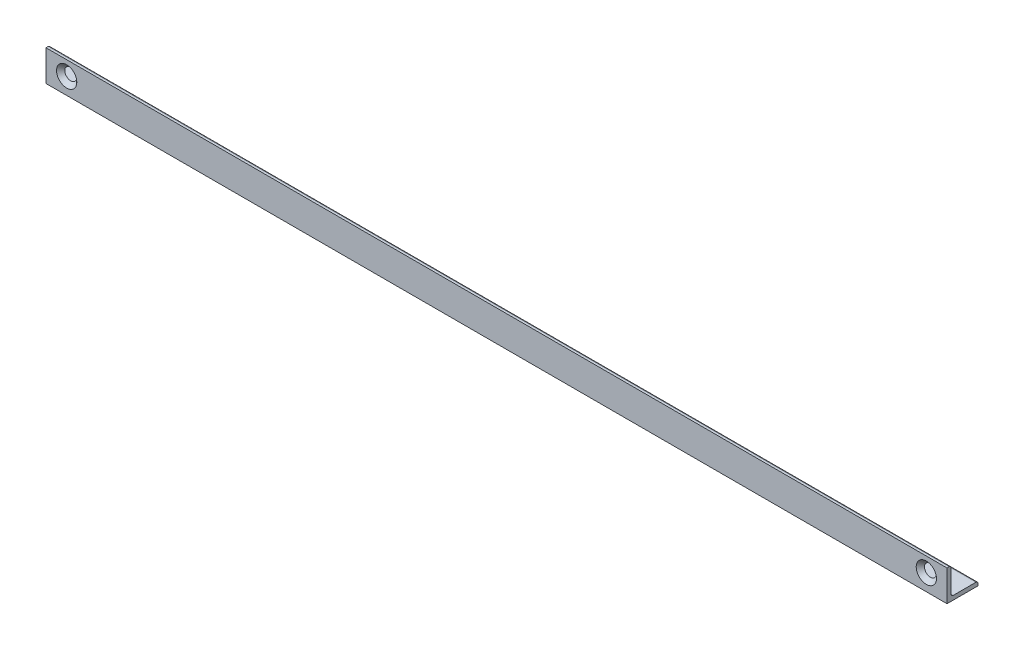
ISO-10303-21;
HEADER;
FILE_DESCRIPTION(('STEP AP214'),'2;1');
FILE_NAME('part.step','',(''),(''),'','','');
FILE_SCHEMA(('AUTOMOTIVE_DESIGN { 1 0 10303 214 1 1 1 1 }'));
ENDSEC;
DATA;
#1=APPLICATION_CONTEXT('core data for automotive mechanical design processes');
#2=APPLICATION_PROTOCOL_DEFINITION('international standard','automotive_design',2000,#1);
#3=PRODUCT_CONTEXT('',#1,'mechanical');
#4=PRODUCT('Part','Part','',(#3));
#5=PRODUCT_RELATED_PRODUCT_CATEGORY('part','',(#4));
#6=PRODUCT_DEFINITION_FORMATION('','',#4);
#7=PRODUCT_DEFINITION_CONTEXT('part definition',#1,'design');
#8=PRODUCT_DEFINITION('design','',#6,#7);
#9=PRODUCT_DEFINITION_SHAPE('','',#8);
#10=(LENGTH_UNIT() NAMED_UNIT(*) SI_UNIT(.MILLI.,.METRE.));
#11=(NAMED_UNIT(*) PLANE_ANGLE_UNIT() SI_UNIT($,.RADIAN.));
#12=(NAMED_UNIT(*) SI_UNIT($,.STERADIAN.) SOLID_ANGLE_UNIT());
#13=UNCERTAINTY_MEASURE_WITH_UNIT(LENGTH_MEASURE(1.E-05),#10,'distance_accuracy_value','');
#14=(GEOMETRIC_REPRESENTATION_CONTEXT(3) GLOBAL_UNCERTAINTY_ASSIGNED_CONTEXT((#13)) GLOBAL_UNIT_ASSIGNED_CONTEXT((#10,
#11,#12)) REPRESENTATION_CONTEXT('',''));
#15=CARTESIAN_POINT('',(0.,0.,0.));
#16=DIRECTION('',(0.,0.,1.));
#17=DIRECTION('',(1.,0.,0.));
#18=AXIS2_PLACEMENT_3D('',#15,#16,#17);
#19=CARTESIAN_POINT('',(436.,0.,0.));
#20=DIRECTION('',(0.,1.,0.));
#21=DIRECTION('',(0.,0.,1.));
#22=AXIS2_PLACEMENT_3D('',#19,#20,#21);
#23=PLANE('',#22);
#24=CARTESIAN_POINT('',(90.,0.,-9.));
#25=DIRECTION('',(0.,-1.,0.));
#26=DIRECTION('',(0.,0.,-1.));
#27=AXIS2_PLACEMENT_3D('',#24,#25,#26);
#28=CIRCLE('',#27,2.75000000000001);
#29=CARTESIAN_POINT('',(90.,0.,-11.75));
#30=VERTEX_POINT('',#29);
#31=EDGE_CURVE('E362',#30,#30,#28,.T.);
#32=ORIENTED_EDGE('',*,*,#31,.F.);
#33=EDGE_LOOP('',(#32));
#34=FACE_BOUND('',#33,.T.);
#35=CARTESIAN_POINT('',(372.,0.,-9.));
#36=DIRECTION('',(0.,-1.,0.));
#37=DIRECTION('',(0.,0.,-1.));
#38=AXIS2_PLACEMENT_3D('',#35,#36,#37);
#39=CIRCLE('',#38,2.74999999999998);
#40=CARTESIAN_POINT('',(372.,0.,-11.75));
#41=VERTEX_POINT('',#40);
#42=EDGE_CURVE('E358',#41,#41,#39,.T.);
#43=ORIENTED_EDGE('',*,*,#42,.F.);
#44=EDGE_LOOP('',(#43));
#45=FACE_BOUND('',#44,.T.);
#46=DIRECTION('',(0.,0.,-1.));
#47=VECTOR('',#46,1.);
#48=CARTESIAN_POINT('',(0.,0.,0.));
#49=LINE('',#48,#47);
#50=CARTESIAN_POINT('',(0.,0.,0.));
#51=VERTEX_POINT('',#50);
#52=CARTESIAN_POINT('',(0.,0.,-15.));
#53=VERTEX_POINT('',#52);
#54=EDGE_CURVE('E139',#51,#53,#49,.T.);
#55=ORIENTED_EDGE('',*,*,#54,.T.);
#56=DIRECTION('',(-1.,0.,0.));
#57=VECTOR('',#56,1.);
#58=CARTESIAN_POINT('',(436.,0.,-15.));
#59=LINE('',#58,#57);
#60=CARTESIAN_POINT('',(436.,0.,-15.));
#61=VERTEX_POINT('',#60);
#62=EDGE_CURVE('E172',#61,#53,#59,.T.);
#63=ORIENTED_EDGE('',*,*,#62,.F.);
#64=DIRECTION('',(0.,0.,-1.));
#65=VECTOR('',#64,1.);
#66=CARTESIAN_POINT('',(436.,0.,0.));
#67=LINE('',#66,#65);
#68=CARTESIAN_POINT('',(436.,0.,0.));
#69=VERTEX_POINT('',#68);
#70=EDGE_CURVE('E156',#69,#61,#67,.T.);
#71=ORIENTED_EDGE('',*,*,#70,.F.);
#72=DIRECTION('',(-1.,0.,0.));
#73=VECTOR('',#72,1.);
#74=CARTESIAN_POINT('',(436.,0.,0.));
#75=LINE('',#74,#73);
#76=EDGE_CURVE('E135',#69,#51,#75,.T.);
#77=ORIENTED_EDGE('',*,*,#76,.T.);
#78=EDGE_LOOP('',(#55,#63,#71,#77));
#79=FACE_BOUND('',#78,.T.);
#80=ADVANCED_FACE('F35',(#34,#45,#79),#23,.F.);
#81=CARTESIAN_POINT('',(436.,1.,-15.));
#82=DIRECTION('',(0.,0.,1.));
#83=DIRECTION('',(1.,0.,0.));
#84=AXIS2_PLACEMENT_3D('',#81,#82,#83);
#85=PLANE('',#84);
#86=DIRECTION('',(0.,1.,0.));
#87=VECTOR('',#86,1.);
#88=CARTESIAN_POINT('',(0.,1.,-15.));
#89=LINE('',#88,#87);
#90=CARTESIAN_POINT('',(0.,1.,-15.));
#91=VERTEX_POINT('',#90);
#92=EDGE_CURVE('E142',#53,#91,#89,.T.);
#93=ORIENTED_EDGE('',*,*,#92,.T.);
#94=DIRECTION('',(-1.,0.,0.));
#95=VECTOR('',#94,1.);
#96=CARTESIAN_POINT('',(436.,1.,-15.));
#97=LINE('',#96,#95);
#98=CARTESIAN_POINT('',(436.,1.,-15.));
#99=VERTEX_POINT('',#98);
#100=EDGE_CURVE('E169',#99,#91,#97,.T.);
#101=ORIENTED_EDGE('',*,*,#100,.F.);
#102=DIRECTION('',(0.,1.,0.));
#103=VECTOR('',#102,1.);
#104=CARTESIAN_POINT('',(436.,1.,-15.));
#105=LINE('',#104,#103);
#106=EDGE_CURVE('E99',#61,#99,#105,.T.);
#107=ORIENTED_EDGE('',*,*,#106,.F.);
#108=ORIENTED_EDGE('',*,*,#62,.T.);
#109=EDGE_LOOP('',(#93,#101,#107,#108));
#110=FACE_BOUND('',#109,.T.);
#111=ADVANCED_FACE('F216',(#110),#85,.F.);
#112=CARTESIAN_POINT('',(436.,1.,-14.));
#113=DIRECTION('',(-1.,0.,0.));
#114=DIRECTION('',(0.,0.,1.));
#115=AXIS2_PLACEMENT_3D('',#112,#113,#114);
#116=CYLINDRICAL_SURFACE('',#115,1.);
#117=CARTESIAN_POINT('',(0.,1.,-14.));
#118=DIRECTION('',(1.,0.,0.));
#119=DIRECTION('',(0.,0.,1.));
#120=AXIS2_PLACEMENT_3D('',#117,#118,#119);
#121=CIRCLE('',#120,1.);
#122=CARTESIAN_POINT('',(0.,2.,-14.));
#123=VERTEX_POINT('',#122);
#124=EDGE_CURVE('E145',#91,#123,#121,.T.);
#125=ORIENTED_EDGE('',*,*,#124,.T.);
#126=DIRECTION('',(-1.,0.,0.));
#127=VECTOR('',#126,1.);
#128=CARTESIAN_POINT('',(436.,2.,-14.));
#129=LINE('',#128,#127);
#130=CARTESIAN_POINT('',(436.,2.,-14.));
#131=VERTEX_POINT('',#130);
#132=EDGE_CURVE('E166',#131,#123,#129,.T.);
#133=ORIENTED_EDGE('',*,*,#132,.F.);
#134=CARTESIAN_POINT('',(436.,1.,-14.));
#135=DIRECTION('',(1.,0.,0.));
#136=DIRECTION('',(0.,0.,1.));
#137=AXIS2_PLACEMENT_3D('',#134,#135,#136);
#138=CIRCLE('',#137,1.);
#139=EDGE_CURVE('E352',#99,#131,#138,.T.);
#140=ORIENTED_EDGE('',*,*,#139,.F.);
#141=ORIENTED_EDGE('',*,*,#100,.T.);
#142=EDGE_LOOP('',(#125,#133,#140,#141));
#143=FACE_BOUND('',#142,.T.);
#144=ADVANCED_FACE('F222',(#143),#116,.T.);
#145=CARTESIAN_POINT('',(436.,2.,-3.));
#146=DIRECTION('',(0.,-1.,0.));
#147=DIRECTION('',(0.,0.,-1.));
#148=AXIS2_PLACEMENT_3D('',#145,#146,#147);
#149=PLANE('',#148);
#150=CARTESIAN_POINT('',(90.,2.,-9.));
#151=DIRECTION('',(0.,-1.,0.));
#152=DIRECTION('',(0.,0.,-1.));
#153=AXIS2_PLACEMENT_3D('',#150,#151,#152);
#154=CIRCLE('',#153,2.75000000000001);
#155=CARTESIAN_POINT('',(90.,2.,-11.75));
#156=VERTEX_POINT('',#155);
#157=EDGE_CURVE('E340',#156,#156,#154,.T.);
#158=ORIENTED_EDGE('',*,*,#157,.T.);
#159=EDGE_LOOP('',(#158));
#160=FACE_BOUND('',#159,.T.);
#161=CARTESIAN_POINT('',(372.,2.,-9.));
#162=DIRECTION('',(0.,-1.,0.));
#163=DIRECTION('',(0.,0.,-1.));
#164=AXIS2_PLACEMENT_3D('',#161,#162,#163);
#165=CIRCLE('',#164,2.74999999999998);
#166=CARTESIAN_POINT('',(372.,2.,-11.75));
#167=VERTEX_POINT('',#166);
#168=EDGE_CURVE('E143',#167,#167,#165,.T.);
#169=ORIENTED_EDGE('',*,*,#168,.T.);
#170=EDGE_LOOP('',(#169));
#171=FACE_BOUND('',#170,.T.);
#172=DIRECTION('',(0.,0.,1.));
#173=VECTOR('',#172,1.);
#174=CARTESIAN_POINT('',(0.,2.,-3.));
#175=LINE('',#174,#173);
#176=CARTESIAN_POINT('',(0.,2.,-3.));
#177=VERTEX_POINT('',#176);
#178=EDGE_CURVE('E147',#123,#177,#175,.T.);
#179=ORIENTED_EDGE('',*,*,#178,.T.);
#180=DIRECTION('',(-1.,0.,0.));
#181=VECTOR('',#180,1.);
#182=CARTESIAN_POINT('',(436.,2.,-3.));
#183=LINE('',#182,#181);
#184=CARTESIAN_POINT('',(436.,2.,-3.));
#185=VERTEX_POINT('',#184);
#186=EDGE_CURVE('E163',#185,#177,#183,.T.);
#187=ORIENTED_EDGE('',*,*,#186,.F.);
#188=DIRECTION('',(0.,0.,1.));
#189=VECTOR('',#188,1.);
#190=CARTESIAN_POINT('',(436.,2.,-3.));
#191=LINE('',#190,#189);
#192=EDGE_CURVE('E350',#131,#185,#191,.T.);
#193=ORIENTED_EDGE('',*,*,#192,.F.);
#194=ORIENTED_EDGE('',*,*,#132,.T.);
#195=EDGE_LOOP('',(#179,#187,#193,#194));
#196=FACE_BOUND('',#195,.T.);
#197=ADVANCED_FACE('F261',(#160,#171,#196),#149,.F.);
#198=CARTESIAN_POINT('',(436.,3.,-3.));
#199=DIRECTION('',(-1.,0.,0.));
#200=DIRECTION('',(0.,0.,1.));
#201=AXIS2_PLACEMENT_3D('',#198,#199,#200);
#202=CYLINDRICAL_SURFACE('',#201,1.);
#203=CARTESIAN_POINT('',(0.,3.,-3.));
#204=DIRECTION('',(-1.,0.,0.));
#205=DIRECTION('',(0.,0.,-1.));
#206=AXIS2_PLACEMENT_3D('',#203,#204,#205);
#207=CIRCLE('',#206,1.);
#208=CARTESIAN_POINT('',(0.,3.,-2.));
#209=VERTEX_POINT('',#208);
#210=EDGE_CURVE('E149',#177,#209,#207,.T.);
#211=ORIENTED_EDGE('',*,*,#210,.T.);
#212=DIRECTION('',(-1.,0.,0.));
#213=VECTOR('',#212,1.);
#214=CARTESIAN_POINT('',(436.,3.,-2.));
#215=LINE('',#214,#213);
#216=CARTESIAN_POINT('',(436.,3.,-2.));
#217=VERTEX_POINT('',#216);
#218=EDGE_CURVE('E160',#217,#209,#215,.T.);
#219=ORIENTED_EDGE('',*,*,#218,.F.);
#220=CARTESIAN_POINT('',(436.,3.,-3.));
#221=DIRECTION('',(-1.,0.,0.));
#222=DIRECTION('',(0.,0.,-1.));
#223=AXIS2_PLACEMENT_3D('',#220,#221,#222);
#224=CIRCLE('',#223,1.);
#225=EDGE_CURVE('E349',#185,#217,#224,.T.);
#226=ORIENTED_EDGE('',*,*,#225,.F.);
#227=ORIENTED_EDGE('',*,*,#186,.T.);
#228=EDGE_LOOP('',(#211,#219,#226,#227));
#229=FACE_BOUND('',#228,.T.);
#230=ADVANCED_FACE('F192',(#229),#202,.F.);
#231=CARTESIAN_POINT('',(436.,14.,-2.));
#232=DIRECTION('',(0.,0.,1.));
#233=DIRECTION('',(0.,-1.,0.));
#234=AXIS2_PLACEMENT_3D('',#231,#232,#233);
#235=PLANE('',#234);
#236=CARTESIAN_POINT('',(10.,8.,-2.));
#237=DIRECTION('',(0.,0.,1.));
#238=DIRECTION('',(0.,-1.,0.));
#239=AXIS2_PLACEMENT_3D('',#236,#237,#238);
#240=CIRCLE('',#239,2.89800000000004);
#241=CARTESIAN_POINT('',(10.,5.10199999999996,-2.));
#242=VERTEX_POINT('',#241);
#243=EDGE_CURVE('E177',#242,#242,#240,.T.);
#244=ORIENTED_EDGE('',*,*,#243,.T.);
#245=EDGE_LOOP('',(#244));
#246=FACE_BOUND('',#245,.T.);
#247=CARTESIAN_POINT('',(426.,8.,-2.));
#248=DIRECTION('',(0.,0.,1.));
#249=DIRECTION('',(0.,-1.,0.));
#250=AXIS2_PLACEMENT_3D('',#247,#248,#249);
#251=CIRCLE('',#250,2.89800000000004);
#252=CARTESIAN_POINT('',(426.,5.10199999999996,-2.));
#253=VERTEX_POINT('',#252);
#254=EDGE_CURVE('E174',#253,#253,#251,.T.);
#255=ORIENTED_EDGE('',*,*,#254,.T.);
#256=EDGE_LOOP('',(#255));
#257=FACE_BOUND('',#256,.T.);
#258=DIRECTION('',(0.,1.,0.));
#259=VECTOR('',#258,1.);
#260=CARTESIAN_POINT('',(0.,14.,-2.));
#261=LINE('',#260,#259);
#262=CARTESIAN_POINT('',(0.,14.,-2.));
#263=VERTEX_POINT('',#262);
#264=EDGE_CURVE('E151',#209,#263,#261,.T.);
#265=ORIENTED_EDGE('',*,*,#264,.T.);
#266=DIRECTION('',(-1.,0.,0.));
#267=VECTOR('',#266,1.);
#268=CARTESIAN_POINT('',(436.,14.,-2.));
#269=LINE('',#268,#267);
#270=CARTESIAN_POINT('',(436.,14.,-2.));
#271=VERTEX_POINT('',#270);
#272=EDGE_CURVE('E130',#271,#263,#269,.T.);
#273=ORIENTED_EDGE('',*,*,#272,.F.);
#274=DIRECTION('',(0.,1.,0.));
#275=VECTOR('',#274,1.);
#276=CARTESIAN_POINT('',(436.,14.,-2.));
#277=LINE('',#276,#275);
#278=EDGE_CURVE('E121',#217,#271,#277,.T.);
#279=ORIENTED_EDGE('',*,*,#278,.F.);
#280=ORIENTED_EDGE('',*,*,#218,.T.);
#281=EDGE_LOOP('',(#265,#273,#279,#280));
#282=FACE_BOUND('',#281,.T.);
#283=ADVANCED_FACE('F189',(#246,#257,#282),#235,.F.);
#284=CARTESIAN_POINT('',(436.,14.,-1.));
#285=DIRECTION('',(-1.,0.,0.));
#286=DIRECTION('',(0.,0.,1.));
#287=AXIS2_PLACEMENT_3D('',#284,#285,#286);
#288=CYLINDRICAL_SURFACE('',#287,1.);
#289=CARTESIAN_POINT('',(0.,14.,-1.));
#290=DIRECTION('',(1.,0.,0.));
#291=DIRECTION('',(0.,0.,1.));
#292=AXIS2_PLACEMENT_3D('',#289,#290,#291);
#293=CIRCLE('',#292,1.);
#294=CARTESIAN_POINT('',(0.,15.,-1.));
#295=VERTEX_POINT('',#294);
#296=EDGE_CURVE('E129',#263,#295,#293,.T.);
#297=ORIENTED_EDGE('',*,*,#296,.T.);
#298=DIRECTION('',(-1.,0.,0.));
#299=VECTOR('',#298,1.);
#300=CARTESIAN_POINT('',(436.,15.,-1.));
#301=LINE('',#300,#299);
#302=CARTESIAN_POINT('',(436.,15.,-1.));
#303=VERTEX_POINT('',#302);
#304=EDGE_CURVE('E126',#303,#295,#301,.T.);
#305=ORIENTED_EDGE('',*,*,#304,.F.);
#306=CARTESIAN_POINT('',(436.,14.,-1.));
#307=DIRECTION('',(1.,0.,0.));
#308=DIRECTION('',(0.,0.,1.));
#309=AXIS2_PLACEMENT_3D('',#306,#307,#308);
#310=CIRCLE('',#309,1.);
#311=EDGE_CURVE('E115',#271,#303,#310,.T.);
#312=ORIENTED_EDGE('',*,*,#311,.F.);
#313=ORIENTED_EDGE('',*,*,#272,.T.);
#314=EDGE_LOOP('',(#297,#305,#312,#313));
#315=FACE_BOUND('',#314,.T.);
#316=ADVANCED_FACE('F127',(#315),#288,.T.);
#317=CARTESIAN_POINT('',(436.,15.,0.));
#318=DIRECTION('',(0.,-1.,0.));
#319=DIRECTION('',(0.,0.,-1.));
#320=AXIS2_PLACEMENT_3D('',#317,#318,#319);
#321=PLANE('',#320);
#322=DIRECTION('',(0.,0.,1.));
#323=VECTOR('',#322,1.);
#324=CARTESIAN_POINT('',(0.,15.,0.));
#325=LINE('',#324,#323);
#326=CARTESIAN_POINT('',(0.,15.,0.));
#327=VERTEX_POINT('',#326);
#328=EDGE_CURVE('E84',#295,#327,#325,.T.);
#329=ORIENTED_EDGE('',*,*,#328,.T.);
#330=DIRECTION('',(-1.,0.,0.));
#331=VECTOR('',#330,1.);
#332=CARTESIAN_POINT('',(436.,15.,0.));
#333=LINE('',#332,#331);
#334=CARTESIAN_POINT('',(436.,15.,0.));
#335=VERTEX_POINT('',#334);
#336=EDGE_CURVE('E131',#335,#327,#333,.T.);
#337=ORIENTED_EDGE('',*,*,#336,.F.);
#338=DIRECTION('',(0.,0.,1.));
#339=VECTOR('',#338,1.);
#340=CARTESIAN_POINT('',(436.,15.,0.));
#341=LINE('',#340,#339);
#342=EDGE_CURVE('E119',#303,#335,#341,.T.);
#343=ORIENTED_EDGE('',*,*,#342,.F.);
#344=ORIENTED_EDGE('',*,*,#304,.T.);
#345=EDGE_LOOP('',(#329,#337,#343,#344));
#346=FACE_BOUND('',#345,.T.);
#347=ADVANCED_FACE('F133',(#346),#321,.F.);
#348=CARTESIAN_POINT('',(436.,0.,0.));
#349=DIRECTION('',(0.,0.,-1.));
#350=DIRECTION('',(-1.,0.,0.));
#351=AXIS2_PLACEMENT_3D('',#348,#349,#350);
#352=PLANE('',#351);
#353=CARTESIAN_POINT('',(10.,8.,0.));
#354=DIRECTION('',(0.,0.,-1.));
#355=DIRECTION('',(-1.,0.,0.));
#356=AXIS2_PLACEMENT_3D('',#353,#354,#355);
#357=CIRCLE('',#356,4.89800000000001);
#358=CARTESIAN_POINT('',(5.10199999999999,8.,0.));
#359=VERTEX_POINT('',#358);
#360=EDGE_CURVE('E11',#359,#359,#357,.T.);
#361=ORIENTED_EDGE('',*,*,#360,.T.);
#362=EDGE_LOOP('',(#361));
#363=FACE_BOUND('',#362,.T.);
#364=CARTESIAN_POINT('',(426.,8.,0.));
#365=DIRECTION('',(0.,0.,-1.));
#366=DIRECTION('',(-1.,0.,0.));
#367=AXIS2_PLACEMENT_3D('',#364,#365,#366);
#368=CIRCLE('',#367,4.89800000000001);
#369=CARTESIAN_POINT('',(421.102,8.,0.));
#370=VERTEX_POINT('',#369);
#371=EDGE_CURVE('E44',#370,#370,#368,.T.);
#372=ORIENTED_EDGE('',*,*,#371,.T.);
#373=EDGE_LOOP('',(#372));
#374=FACE_BOUND('',#373,.T.);
#375=DIRECTION('',(0.,-1.,0.));
#376=VECTOR('',#375,1.);
#377=CARTESIAN_POINT('',(0.,0.,0.));
#378=LINE('',#377,#376);
#379=EDGE_CURVE('E90',#327,#51,#378,.T.);
#380=ORIENTED_EDGE('',*,*,#379,.T.);
#381=ORIENTED_EDGE('',*,*,#76,.F.);
#382=DIRECTION('',(0.,-1.,0.));
#383=VECTOR('',#382,1.);
#384=CARTESIAN_POINT('',(436.,0.,0.));
#385=LINE('',#384,#383);
#386=EDGE_CURVE('E52',#335,#69,#385,.T.);
#387=ORIENTED_EDGE('',*,*,#386,.F.);
#388=ORIENTED_EDGE('',*,*,#336,.T.);
#389=EDGE_LOOP('',(#380,#381,#387,#388));
#390=FACE_BOUND('',#389,.T.);
#391=ADVANCED_FACE('F182',(#363,#374,#390),#352,.F.);
#392=CARTESIAN_POINT('',(436.,1.,-14.));
#393=DIRECTION('',(-1.,0.,0.));
#394=DIRECTION('',(0.,0.,1.));
#395=AXIS2_PLACEMENT_3D('',#392,#393,#394);
#396=PLANE('',#395);
#397=ORIENTED_EDGE('',*,*,#70,.T.);
#398=ORIENTED_EDGE('',*,*,#106,.T.);
#399=ORIENTED_EDGE('',*,*,#139,.T.);
#400=ORIENTED_EDGE('',*,*,#192,.T.);
#401=ORIENTED_EDGE('',*,*,#225,.T.);
#402=ORIENTED_EDGE('',*,*,#278,.T.);
#403=ORIENTED_EDGE('',*,*,#311,.T.);
#404=ORIENTED_EDGE('',*,*,#342,.T.);
#405=ORIENTED_EDGE('',*,*,#386,.T.);
#406=EDGE_LOOP('',(#397,#398,#399,#400,#401,#402,#403,#404,#405));
#407=FACE_BOUND('',#406,.T.);
#408=ADVANCED_FACE('F117',(#407),#396,.F.);
#409=CARTESIAN_POINT('',(0.,1.,-14.));
#410=DIRECTION('',(-1.,0.,0.));
#411=DIRECTION('',(0.,0.,1.));
#412=AXIS2_PLACEMENT_3D('',#409,#410,#411);
#413=PLANE('',#412);
#414=ORIENTED_EDGE('',*,*,#54,.F.);
#415=ORIENTED_EDGE('',*,*,#379,.F.);
#416=ORIENTED_EDGE('',*,*,#328,.F.);
#417=ORIENTED_EDGE('',*,*,#296,.F.);
#418=ORIENTED_EDGE('',*,*,#264,.F.);
#419=ORIENTED_EDGE('',*,*,#210,.F.);
#420=ORIENTED_EDGE('',*,*,#178,.F.);
#421=ORIENTED_EDGE('',*,*,#124,.F.);
#422=ORIENTED_EDGE('',*,*,#92,.F.);
#423=EDGE_LOOP('',(#414,#415,#416,#417,#418,#419,#420,#421,#422));
#424=FACE_BOUND('',#423,.T.);
#425=ADVANCED_FACE('F200',(#424),#413,.T.);
#426=CARTESIAN_POINT('',(372.,2.,-9.));
#427=DIRECTION('',(0.,-1.,0.));
#428=DIRECTION('',(0.,0.,-1.));
#429=AXIS2_PLACEMENT_3D('',#426,#427,#428);
#430=CYLINDRICAL_SURFACE('',#429,2.74999999999998);
#431=ORIENTED_EDGE('',*,*,#168,.F.);
#432=EDGE_LOOP('',(#431));
#433=FACE_BOUND('',#432,.T.);
#434=ORIENTED_EDGE('',*,*,#42,.T.);
#435=EDGE_LOOP('',(#434));
#436=FACE_BOUND('',#435,.T.);
#437=ADVANCED_FACE('F233',(#433,#436),#430,.F.);
#438=CARTESIAN_POINT('',(90.,2.,-9.));
#439=DIRECTION('',(0.,-1.,0.));
#440=DIRECTION('',(0.,0.,-1.));
#441=AXIS2_PLACEMENT_3D('',#438,#439,#440);
#442=CYLINDRICAL_SURFACE('',#441,2.75000000000001);
#443=ORIENTED_EDGE('',*,*,#157,.F.);
#444=EDGE_LOOP('',(#443));
#445=FACE_BOUND('',#444,.T.);
#446=ORIENTED_EDGE('',*,*,#31,.T.);
#447=EDGE_LOOP('',(#446));
#448=FACE_BOUND('',#447,.T.);
#449=ADVANCED_FACE('F228',(#445,#448),#442,.F.);
#450=CARTESIAN_POINT('',(10.,8.,-2.09800000000004));
#451=DIRECTION('',(0.,0.,1.));
#452=DIRECTION('',(1.,0.,0.));
#453=AXIS2_PLACEMENT_3D('',#450,#451,#452);
#454=CONICAL_SURFACE('',#453,2.8,0.785398163397443);
#455=ORIENTED_EDGE('',*,*,#360,.F.);
#456=EDGE_LOOP('',(#455));
#457=FACE_BOUND('',#456,.T.);
#458=ORIENTED_EDGE('',*,*,#243,.F.);
#459=EDGE_LOOP('',(#458));
#460=FACE_BOUND('',#459,.T.);
#461=ADVANCED_FACE('F186',(#457,#460),#454,.F.);
#462=CARTESIAN_POINT('',(426.,8.,-2.09800000000004));
#463=DIRECTION('',(0.,0.,1.));
#464=DIRECTION('',(1.,0.,0.));
#465=AXIS2_PLACEMENT_3D('',#462,#463,#464);
#466=CONICAL_SURFACE('',#465,2.80000000000001,0.785398163397441);
#467=ORIENTED_EDGE('',*,*,#371,.F.);
#468=EDGE_LOOP('',(#467));
#469=FACE_BOUND('',#468,.T.);
#470=ORIENTED_EDGE('',*,*,#254,.F.);
#471=EDGE_LOOP('',(#470));
#472=FACE_BOUND('',#471,.T.);
#473=ADVANCED_FACE('F37',(#469,#472),#466,.F.);
#474=CLOSED_SHELL('',(#80,#111,#144,#197,#230,#283,#316,#347,#391,#408,#425,#437,#449,#461,#473));
#475=MANIFOLD_SOLID_BREP('B2',#474);
#476=ADVANCED_BREP_SHAPE_REPRESENTATION('',(#18,#475),#14);
#477=SHAPE_DEFINITION_REPRESENTATION(#9,#476);
ENDSEC;
END-ISO-10303-21;
